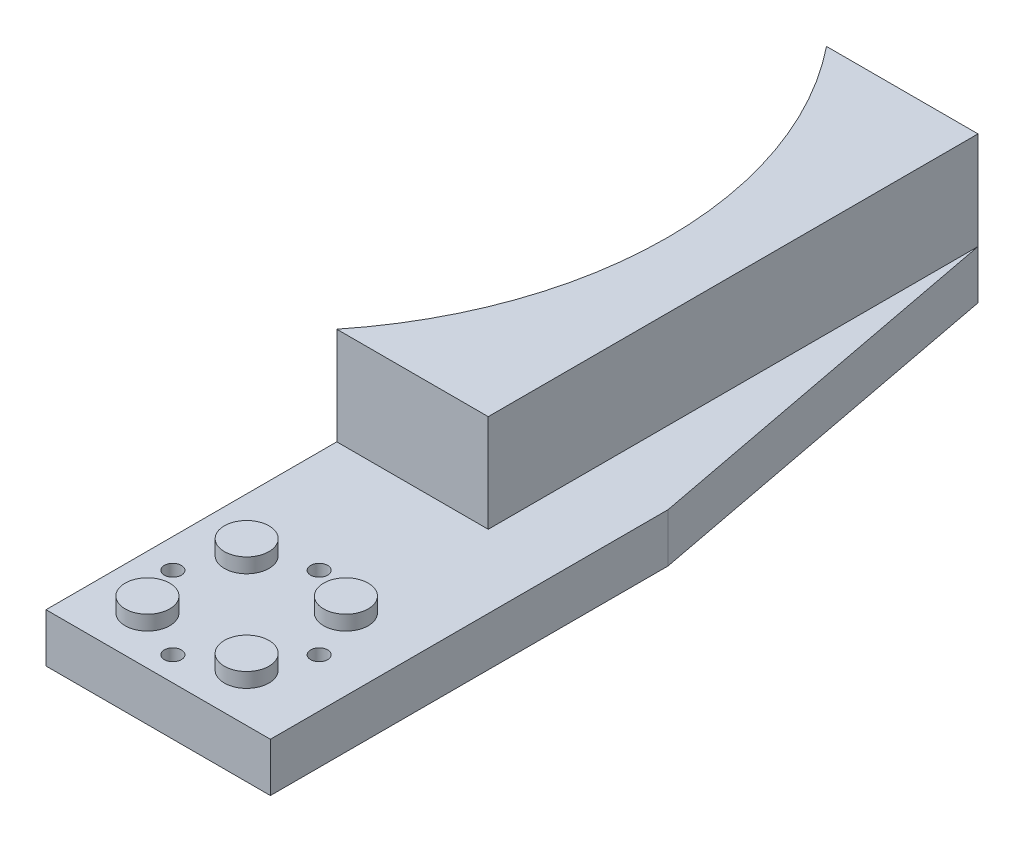
ISO-10303-21;
HEADER;
FILE_DESCRIPTION(('STEP AP214'),'2;1');
FILE_NAME('part.step','',(''),(''),'','','');
FILE_SCHEMA(('AUTOMOTIVE_DESIGN { 1 0 10303 214 1 1 1 1 }'));
ENDSEC;
DATA;
#1=APPLICATION_CONTEXT('core data for automotive mechanical design processes');
#2=APPLICATION_PROTOCOL_DEFINITION('international standard','automotive_design',2000,#1);
#3=PRODUCT_CONTEXT('',#1,'mechanical');
#4=PRODUCT('Part','Part','',(#3));
#5=PRODUCT_RELATED_PRODUCT_CATEGORY('part','',(#4));
#6=PRODUCT_DEFINITION_FORMATION('','',#4);
#7=PRODUCT_DEFINITION_CONTEXT('part definition',#1,'design');
#8=PRODUCT_DEFINITION('design','',#6,#7);
#9=PRODUCT_DEFINITION_SHAPE('','',#8);
#10=(LENGTH_UNIT() NAMED_UNIT(*) SI_UNIT(.MILLI.,.METRE.));
#11=(NAMED_UNIT(*) PLANE_ANGLE_UNIT() SI_UNIT($,.RADIAN.));
#12=(NAMED_UNIT(*) SI_UNIT($,.STERADIAN.) SOLID_ANGLE_UNIT());
#13=UNCERTAINTY_MEASURE_WITH_UNIT(LENGTH_MEASURE(1.E-05),#10,'distance_accuracy_value','');
#14=(GEOMETRIC_REPRESENTATION_CONTEXT(3) GLOBAL_UNCERTAINTY_ASSIGNED_CONTEXT((#13)) GLOBAL_UNIT_ASSIGNED_CONTEXT((#10,
#11,#12)) REPRESENTATION_CONTEXT('',''));
#15=CARTESIAN_POINT('',(0.,0.,0.));
#16=DIRECTION('',(0.,0.,1.));
#17=DIRECTION('',(1.,0.,0.));
#18=AXIS2_PLACEMENT_3D('',#15,#16,#17);
#19=CARTESIAN_POINT('',(0.,10.,0.));
#20=DIRECTION('',(0.,1.,0.));
#21=DIRECTION('',(0.,0.,1.));
#22=AXIS2_PLACEMENT_3D('',#19,#20,#21);
#23=PLANE('',#22);
#24=CARTESIAN_POINT('',(15.,10.,0.));
#25=DIRECTION('',(0.,1.,0.));
#26=DIRECTION('',(0.,0.,1.));
#27=AXIS2_PLACEMENT_3D('',#24,#25,#26);
#28=CIRCLE('',#27,1.75);
#29=CARTESIAN_POINT('',(15.,10.,1.75));
#30=VERTEX_POINT('',#29);
#31=EDGE_CURVE('E170',#30,#30,#28,.T.);
#32=ORIENTED_EDGE('',*,*,#31,.F.);
#33=EDGE_LOOP('',(#32));
#34=FACE_BOUND('',#33,.T.);
#35=CARTESIAN_POINT('',(-15.,10.,0.));
#36=DIRECTION('',(0.,1.,0.));
#37=DIRECTION('',(0.,0.,1.));
#38=AXIS2_PLACEMENT_3D('',#35,#36,#37);
#39=CIRCLE('',#38,1.75);
#40=CARTESIAN_POINT('',(-15.,10.,1.75));
#41=VERTEX_POINT('',#40);
#42=EDGE_CURVE('E173',#41,#41,#39,.T.);
#43=ORIENTED_EDGE('',*,*,#42,.F.);
#44=EDGE_LOOP('',(#43));
#45=FACE_BOUND('',#44,.T.);
#46=CARTESIAN_POINT('',(0.,10.,-15.));
#47=DIRECTION('',(0.,1.,0.));
#48=DIRECTION('',(0.,0.,1.));
#49=AXIS2_PLACEMENT_3D('',#46,#47,#48);
#50=CIRCLE('',#49,1.75);
#51=CARTESIAN_POINT('',(0.,10.,-13.25));
#52=VERTEX_POINT('',#51);
#53=EDGE_CURVE('E179',#52,#52,#50,.T.);
#54=ORIENTED_EDGE('',*,*,#53,.F.);
#55=EDGE_LOOP('',(#54));
#56=FACE_BOUND('',#55,.T.);
#57=CARTESIAN_POINT('',(0.,10.,15.));
#58=DIRECTION('',(0.,1.,0.));
#59=DIRECTION('',(0.,0.,1.));
#60=AXIS2_PLACEMENT_3D('',#57,#58,#59);
#61=CIRCLE('',#60,1.75);
#62=CARTESIAN_POINT('',(0.,10.,16.75));
#63=VERTEX_POINT('',#62);
#64=EDGE_CURVE('E185',#63,#63,#61,.T.);
#65=ORIENTED_EDGE('',*,*,#64,.F.);
#66=EDGE_LOOP('',(#65));
#67=FACE_BOUND('',#66,.T.);
#68=CARTESIAN_POINT('',(10.306950849907,10.,10.1718220925609));
#69=DIRECTION('',(0.,1.,0.));
#70=DIRECTION('',(0.707106781186544,0.,-0.707106781186551));
#71=AXIS2_PLACEMENT_3D('',#68,#69,#70);
#72=CIRCLE('',#71,4.575);
#73=CARTESIAN_POINT('',(13.5419643738354,10.,6.93680856863244));
#74=VERTEX_POINT('',#73);
#75=EDGE_CURVE('E209',#74,#74,#72,.T.);
#76=ORIENTED_EDGE('',*,*,#75,.F.);
#77=EDGE_LOOP('',(#76));
#78=FACE_BOUND('',#77,.T.);
#79=CARTESIAN_POINT('',(10.3069508499069,10.,-10.1718220925611));
#80=DIRECTION('',(0.,1.,0.));
#81=DIRECTION('',(-0.707106781186554,0.,-0.707106781186541));
#82=AXIS2_PLACEMENT_3D('',#79,#80,#81);
#83=CIRCLE('',#82,4.575);
#84=CARTESIAN_POINT('',(7.07193732597838,10.,-13.4068356164895));
#85=VERTEX_POINT('',#84);
#86=EDGE_CURVE('E202',#85,#85,#83,.T.);
#87=ORIENTED_EDGE('',*,*,#86,.F.);
#88=EDGE_LOOP('',(#87));
#89=FACE_BOUND('',#88,.T.);
#90=CARTESIAN_POINT('',(-10.0366933352151,10.,-10.1718220925608));
#91=DIRECTION('',(0.,1.,0.));
#92=DIRECTION('',(-0.707106781186539,0.,0.707106781186556));
#93=AXIS2_PLACEMENT_3D('',#90,#91,#92);
#94=CIRCLE('',#93,4.575);
#95=CARTESIAN_POINT('',(-13.2717068591435,10.,-6.93680856863235));
#96=VERTEX_POINT('',#95);
#97=EDGE_CURVE('E198',#96,#96,#94,.T.);
#98=ORIENTED_EDGE('',*,*,#97,.F.);
#99=EDGE_LOOP('',(#98));
#100=FACE_BOUND('',#99,.T.);
#101=CARTESIAN_POINT('',(-10.036693335215,10.,10.171822092561));
#102=DIRECTION('',(0.,1.,0.));
#103=DIRECTION('',(0.707106781186549,0.,0.707106781186546));
#104=AXIS2_PLACEMENT_3D('',#101,#102,#103);
#105=CIRCLE('',#104,4.575);
#106=CARTESIAN_POINT('',(-6.80167981128649,10.,13.4068356164894));
#107=VERTEX_POINT('',#106);
#108=EDGE_CURVE('E208',#107,#107,#105,.T.);
#109=ORIENTED_EDGE('',*,*,#108,.F.);
#110=EDGE_LOOP('',(#109));
#111=FACE_BOUND('',#110,.T.);
#112=DIRECTION('',(-0.187076296881143,0.,-0.982345386890598));
#113=VECTOR('',#112,1.);
#114=CARTESIAN_POINT('',(10.0516483873566,10.,-140.));
#115=LINE('',#114,#113);
#116=CARTESIAN_POINT('',(25.,10.,-61.5055862601955));
#117=VERTEX_POINT('',#116);
#118=CARTESIAN_POINT('',(10.0516483873566,10.,-140.));
#119=VERTEX_POINT('',#118);
#120=EDGE_CURVE('E153',#117,#119,#115,.T.);
#121=ORIENTED_EDGE('',*,*,#120,.T.);
#122=DIRECTION('',(0.,0.,-1.));
#123=VECTOR('',#122,1.);
#124=CARTESIAN_POINT('',(10.0516483873566,10.,-140.));
#125=LINE('',#124,#123);
#126=CARTESIAN_POINT('',(10.0516483873566,10.,-39.601862885216));
#127=VERTEX_POINT('',#126);
#128=EDGE_CURVE('E56',#127,#119,#125,.T.);
#129=ORIENTED_EDGE('',*,*,#128,.F.);
#130=DIRECTION('',(1.,0.,0.));
#131=VECTOR('',#130,1.);
#132=CARTESIAN_POINT('',(10.0516483873566,10.,-39.601862885216));
#133=LINE('',#132,#131);
#134=CARTESIAN_POINT('',(-21.,10.,-39.601862885216));
#135=VERTEX_POINT('',#134);
#136=EDGE_CURVE('E138',#135,#127,#133,.T.);
#137=ORIENTED_EDGE('',*,*,#136,.F.);
#138=DIRECTION('',(0.,0.,-1.));
#139=VECTOR('',#138,1.);
#140=CARTESIAN_POINT('',(-21.,10.,20.));
#141=LINE('',#140,#139);
#142=CARTESIAN_POINT('',(-21.,10.,20.));
#143=VERTEX_POINT('',#142);
#144=EDGE_CURVE('E159',#143,#135,#141,.T.);
#145=ORIENTED_EDGE('',*,*,#144,.F.);
#146=DIRECTION('',(-1.,0.,0.));
#147=VECTOR('',#146,1.);
#148=CARTESIAN_POINT('',(25.,10.,20.));
#149=LINE('',#148,#147);
#150=CARTESIAN_POINT('',(25.,10.,20.));
#151=VERTEX_POINT('',#150);
#152=EDGE_CURVE('E169',#151,#143,#149,.T.);
#153=ORIENTED_EDGE('',*,*,#152,.F.);
#154=DIRECTION('',(0.,0.,-1.));
#155=VECTOR('',#154,1.);
#156=CARTESIAN_POINT('',(25.,10.,-70.));
#157=LINE('',#156,#155);
#158=EDGE_CURVE('E11',#151,#117,#157,.T.);
#159=ORIENTED_EDGE('',*,*,#158,.T.);
#160=EDGE_LOOP('',(#121,#129,#137,#145,#153,#159));
#161=FACE_BOUND('',#160,.T.);
#162=ADVANCED_FACE('F41',(#34,#45,#56,#67,#78,#89,#100,#111,#161),#23,.T.);
#163=CARTESIAN_POINT('',(25.,10.,-70.));
#164=DIRECTION('',(-1.,0.,0.));
#165=DIRECTION('',(0.,0.,1.));
#166=AXIS2_PLACEMENT_3D('',#163,#164,#165);
#167=PLANE('',#166);
#168=DIRECTION('',(0.,0.,-1.));
#169=VECTOR('',#168,1.);
#170=CARTESIAN_POINT('',(25.,0.,-70.));
#171=LINE('',#170,#169);
#172=CARTESIAN_POINT('',(25.,0.,20.));
#173=VERTEX_POINT('',#172);
#174=CARTESIAN_POINT('',(25.,0.,-61.5055862601955));
#175=VERTEX_POINT('',#174);
#176=EDGE_CURVE('E45',#173,#175,#171,.T.);
#177=ORIENTED_EDGE('',*,*,#176,.T.);
#178=DIRECTION('',(0.,-1.,0.));
#179=VECTOR('',#178,1.);
#180=CARTESIAN_POINT('',(25.,10.,-61.5055862601955));
#181=LINE('',#180,#179);
#182=EDGE_CURVE('E155',#117,#175,#181,.T.);
#183=ORIENTED_EDGE('',*,*,#182,.F.);
#184=ORIENTED_EDGE('',*,*,#158,.F.);
#185=DIRECTION('',(0.,1.,0.));
#186=VECTOR('',#185,1.);
#187=CARTESIAN_POINT('',(25.,0.,20.));
#188=LINE('',#187,#186);
#189=EDGE_CURVE('E193',#173,#151,#188,.T.);
#190=ORIENTED_EDGE('',*,*,#189,.F.);
#191=EDGE_LOOP('',(#177,#183,#184,#190));
#192=FACE_BOUND('',#191,.T.);
#193=ADVANCED_FACE('F43',(#192),#167,.F.);
#194=CARTESIAN_POINT('',(0.,0.,0.));
#195=DIRECTION('',(0.,1.,0.));
#196=DIRECTION('',(0.,0.,1.));
#197=AXIS2_PLACEMENT_3D('',#194,#195,#196);
#198=PLANE('',#197);
#199=CARTESIAN_POINT('',(15.,0.,0.));
#200=DIRECTION('',(0.,1.,0.));
#201=DIRECTION('',(0.,0.,1.));
#202=AXIS2_PLACEMENT_3D('',#199,#200,#201);
#203=CIRCLE('',#202,1.75);
#204=CARTESIAN_POINT('',(15.,0.,1.75));
#205=VERTEX_POINT('',#204);
#206=EDGE_CURVE('E166',#205,#205,#203,.T.);
#207=ORIENTED_EDGE('',*,*,#206,.T.);
#208=EDGE_LOOP('',(#207));
#209=FACE_BOUND('',#208,.T.);
#210=CARTESIAN_POINT('',(-15.,0.,0.));
#211=DIRECTION('',(0.,1.,0.));
#212=DIRECTION('',(0.,0.,1.));
#213=AXIS2_PLACEMENT_3D('',#210,#211,#212);
#214=CIRCLE('',#213,1.75);
#215=CARTESIAN_POINT('',(-15.,0.,1.75));
#216=VERTEX_POINT('',#215);
#217=EDGE_CURVE('E176',#216,#216,#214,.T.);
#218=ORIENTED_EDGE('',*,*,#217,.T.);
#219=EDGE_LOOP('',(#218));
#220=FACE_BOUND('',#219,.T.);
#221=CARTESIAN_POINT('',(0.,0.,-15.));
#222=DIRECTION('',(0.,1.,0.));
#223=DIRECTION('',(0.,0.,1.));
#224=AXIS2_PLACEMENT_3D('',#221,#222,#223);
#225=CIRCLE('',#224,1.75);
#226=CARTESIAN_POINT('',(0.,0.,-13.25));
#227=VERTEX_POINT('',#226);
#228=EDGE_CURVE('E182',#227,#227,#225,.T.);
#229=ORIENTED_EDGE('',*,*,#228,.T.);
#230=EDGE_LOOP('',(#229));
#231=FACE_BOUND('',#230,.T.);
#232=CARTESIAN_POINT('',(0.,0.,15.));
#233=DIRECTION('',(0.,1.,0.));
#234=DIRECTION('',(0.,0.,1.));
#235=AXIS2_PLACEMENT_3D('',#232,#233,#234);
#236=CIRCLE('',#235,1.75);
#237=CARTESIAN_POINT('',(0.,0.,16.75));
#238=VERTEX_POINT('',#237);
#239=EDGE_CURVE('E118',#238,#238,#236,.T.);
#240=ORIENTED_EDGE('',*,*,#239,.T.);
#241=EDGE_LOOP('',(#240));
#242=FACE_BOUND('',#241,.T.);
#243=DIRECTION('',(0.,0.,-1.));
#244=VECTOR('',#243,1.);
#245=CARTESIAN_POINT('',(-21.,0.,20.));
#246=LINE('',#245,#244);
#247=CARTESIAN_POINT('',(-21.,0.,20.));
#248=VERTEX_POINT('',#247);
#249=CARTESIAN_POINT('',(-21.,0.,-39.601862885216));
#250=VERTEX_POINT('',#249);
#251=EDGE_CURVE('E161',#248,#250,#246,.T.);
#252=ORIENTED_EDGE('',*,*,#251,.T.);
#253=CARTESIAN_POINT('',(-83.6264533897523,0.,-89.800931442608));
#254=DIRECTION('',(0.,-1.,0.));
#255=DIRECTION('',(0.,0.,-1.));
#256=AXIS2_PLACEMENT_3D('',#253,#254,#255);
#257=CIRCLE('',#256,80.2621900287337);
#258=CARTESIAN_POINT('',(-21.,0.,-140.));
#259=VERTEX_POINT('',#258);
#260=EDGE_CURVE('E148',#259,#250,#257,.T.);
#261=ORIENTED_EDGE('',*,*,#260,.F.);
#262=DIRECTION('',(-1.,0.,0.));
#263=VECTOR('',#262,1.);
#264=CARTESIAN_POINT('',(25.,0.,-140.));
#265=LINE('',#264,#263);
#266=CARTESIAN_POINT('',(10.0516483873566,0.,-140.));
#267=VERTEX_POINT('',#266);
#268=EDGE_CURVE('E115',#267,#259,#265,.T.);
#269=ORIENTED_EDGE('',*,*,#268,.F.);
#270=DIRECTION('',(-0.187076296881143,0.,-0.982345386890598));
#271=VECTOR('',#270,1.);
#272=CARTESIAN_POINT('',(10.0516483873566,0.,-140.));
#273=LINE('',#272,#271);
#274=EDGE_CURVE('E64',#175,#267,#273,.T.);
#275=ORIENTED_EDGE('',*,*,#274,.F.);
#276=ORIENTED_EDGE('',*,*,#176,.F.);
#277=DIRECTION('',(-1.,0.,0.));
#278=VECTOR('',#277,1.);
#279=CARTESIAN_POINT('',(25.,0.,20.));
#280=LINE('',#279,#278);
#281=EDGE_CURVE('E190',#173,#248,#280,.T.);
#282=ORIENTED_EDGE('',*,*,#281,.T.);
#283=EDGE_LOOP('',(#252,#261,#269,#275,#276,#282));
#284=FACE_BOUND('',#283,.T.);
#285=ADVANCED_FACE('F246',(#209,#220,#231,#242,#284),#198,.F.);
#286=CARTESIAN_POINT('',(-10.036693335215,13.,10.171822092561));
#287=DIRECTION('',(0.,-1.,0.));
#288=DIRECTION('',(0.,0.,-1.));
#289=AXIS2_PLACEMENT_3D('',#286,#287,#288);
#290=CYLINDRICAL_SURFACE('',#289,4.575);
#291=CARTESIAN_POINT('',(-10.036693335215,13.,10.171822092561));
#292=DIRECTION('',(0.,1.,0.));
#293=DIRECTION('',(0.707106781186549,0.,0.707106781186546));
#294=AXIS2_PLACEMENT_3D('',#291,#292,#293);
#295=CIRCLE('',#294,4.575);
#296=CARTESIAN_POINT('',(-6.80167981128649,13.,13.4068356164894));
#297=VERTEX_POINT('',#296);
#298=EDGE_CURVE('E217',#297,#297,#295,.T.);
#299=ORIENTED_EDGE('',*,*,#298,.F.);
#300=EDGE_LOOP('',(#299));
#301=FACE_BOUND('',#300,.T.);
#302=ORIENTED_EDGE('',*,*,#108,.T.);
#303=EDGE_LOOP('',(#302));
#304=FACE_BOUND('',#303,.T.);
#305=ADVANCED_FACE('F223',(#301,#304),#290,.T.);
#306=CARTESIAN_POINT('',(-10.036693335215,13.,10.171822092561));
#307=DIRECTION('',(0.,1.,0.));
#308=DIRECTION('',(0.707106781186549,0.,0.707106781186546));
#309=AXIS2_PLACEMENT_3D('',#306,#307,#308);
#310=PLANE('',#309);
#311=ORIENTED_EDGE('',*,*,#298,.T.);
#312=EDGE_LOOP('',(#311));
#313=FACE_BOUND('',#312,.T.);
#314=ADVANCED_FACE('F287',(#313),#310,.T.);
#315=CARTESIAN_POINT('',(-10.0366933352151,13.,-10.1718220925608));
#316=DIRECTION('',(0.,-1.,0.));
#317=DIRECTION('',(0.,0.,-1.));
#318=AXIS2_PLACEMENT_3D('',#315,#316,#317);
#319=CYLINDRICAL_SURFACE('',#318,4.575);
#320=CARTESIAN_POINT('',(-10.0366933352151,13.,-10.1718220925608));
#321=DIRECTION('',(0.,1.,0.));
#322=DIRECTION('',(-0.707106781186539,0.,0.707106781186556));
#323=AXIS2_PLACEMENT_3D('',#320,#321,#322);
#324=CIRCLE('',#323,4.575);
#325=CARTESIAN_POINT('',(-13.2717068591435,13.,-6.93680856863235));
#326=VERTEX_POINT('',#325);
#327=EDGE_CURVE('E199',#326,#326,#324,.T.);
#328=ORIENTED_EDGE('',*,*,#327,.F.);
#329=EDGE_LOOP('',(#328));
#330=FACE_BOUND('',#329,.T.);
#331=ORIENTED_EDGE('',*,*,#97,.T.);
#332=EDGE_LOOP('',(#331));
#333=FACE_BOUND('',#332,.T.);
#334=ADVANCED_FACE('F283',(#330,#333),#319,.T.);
#335=CARTESIAN_POINT('',(-10.0366933352151,13.,-10.1718220925608));
#336=DIRECTION('',(0.,1.,0.));
#337=DIRECTION('',(-0.707106781186539,0.,0.707106781186556));
#338=AXIS2_PLACEMENT_3D('',#335,#336,#337);
#339=PLANE('',#338);
#340=ORIENTED_EDGE('',*,*,#327,.T.);
#341=EDGE_LOOP('',(#340));
#342=FACE_BOUND('',#341,.T.);
#343=ADVANCED_FACE('F279',(#342),#339,.T.);
#344=CARTESIAN_POINT('',(10.3069508499069,13.,-10.1718220925611));
#345=DIRECTION('',(0.,-1.,0.));
#346=DIRECTION('',(0.,0.,-1.));
#347=AXIS2_PLACEMENT_3D('',#344,#345,#346);
#348=CYLINDRICAL_SURFACE('',#347,4.575);
#349=CARTESIAN_POINT('',(10.3069508499069,13.,-10.1718220925611));
#350=DIRECTION('',(0.,1.,0.));
#351=DIRECTION('',(-0.707106781186554,0.,-0.707106781186541));
#352=AXIS2_PLACEMENT_3D('',#349,#350,#351);
#353=CIRCLE('',#352,4.575);
#354=CARTESIAN_POINT('',(7.07193732597838,13.,-13.4068356164895));
#355=VERTEX_POINT('',#354);
#356=EDGE_CURVE('E212',#355,#355,#353,.T.);
#357=ORIENTED_EDGE('',*,*,#356,.F.);
#358=EDGE_LOOP('',(#357));
#359=FACE_BOUND('',#358,.T.);
#360=ORIENTED_EDGE('',*,*,#86,.T.);
#361=EDGE_LOOP('',(#360));
#362=FACE_BOUND('',#361,.T.);
#363=ADVANCED_FACE('F282',(#359,#362),#348,.T.);
#364=CARTESIAN_POINT('',(10.3069508499069,13.,-10.1718220925611));
#365=DIRECTION('',(0.,1.,0.));
#366=DIRECTION('',(-0.707106781186554,0.,-0.707106781186541));
#367=AXIS2_PLACEMENT_3D('',#364,#365,#366);
#368=PLANE('',#367);
#369=ORIENTED_EDGE('',*,*,#356,.T.);
#370=EDGE_LOOP('',(#369));
#371=FACE_BOUND('',#370,.T.);
#372=ADVANCED_FACE('F295',(#371),#368,.T.);
#373=CARTESIAN_POINT('',(10.306950849907,13.,10.1718220925609));
#374=DIRECTION('',(0.,-1.,0.));
#375=DIRECTION('',(0.,0.,-1.));
#376=AXIS2_PLACEMENT_3D('',#373,#374,#375);
#377=CYLINDRICAL_SURFACE('',#376,4.575);
#378=CARTESIAN_POINT('',(10.306950849907,13.,10.1718220925609));
#379=DIRECTION('',(0.,1.,0.));
#380=DIRECTION('',(0.707106781186544,0.,-0.707106781186551));
#381=AXIS2_PLACEMENT_3D('',#378,#379,#380);
#382=CIRCLE('',#381,4.575);
#383=CARTESIAN_POINT('',(13.5419643738354,13.,6.93680856863244));
#384=VERTEX_POINT('',#383);
#385=EDGE_CURVE('E205',#384,#384,#382,.T.);
#386=ORIENTED_EDGE('',*,*,#385,.F.);
#387=EDGE_LOOP('',(#386));
#388=FACE_BOUND('',#387,.T.);
#389=ORIENTED_EDGE('',*,*,#75,.T.);
#390=EDGE_LOOP('',(#389));
#391=FACE_BOUND('',#390,.T.);
#392=ADVANCED_FACE('F291',(#388,#391),#377,.T.);
#393=CARTESIAN_POINT('',(10.306950849907,13.,10.1718220925609));
#394=DIRECTION('',(0.,1.,0.));
#395=DIRECTION('',(0.707106781186544,0.,-0.707106781186551));
#396=AXIS2_PLACEMENT_3D('',#393,#394,#395);
#397=PLANE('',#396);
#398=ORIENTED_EDGE('',*,*,#385,.T.);
#399=EDGE_LOOP('',(#398));
#400=FACE_BOUND('',#399,.T.);
#401=ADVANCED_FACE('F278',(#400),#397,.T.);
#402=CARTESIAN_POINT('',(0.,0.,-140.));
#403=DIRECTION('',(0.,0.,-1.));
#404=DIRECTION('',(-1.,0.,0.));
#405=AXIS2_PLACEMENT_3D('',#402,#403,#404);
#406=PLANE('',#405);
#407=DIRECTION('',(0.,-1.,0.));
#408=VECTOR('',#407,1.);
#409=CARTESIAN_POINT('',(10.0516483873566,10.,-140.));
#410=LINE('',#409,#408);
#411=EDGE_CURVE('E157',#119,#267,#410,.T.);
#412=ORIENTED_EDGE('',*,*,#411,.T.);
#413=ORIENTED_EDGE('',*,*,#268,.T.);
#414=DIRECTION('',(0.,1.,0.));
#415=VECTOR('',#414,1.);
#416=CARTESIAN_POINT('',(-21.,0.,-140.));
#417=LINE('',#416,#415);
#418=CARTESIAN_POINT('',(-21.,30.,-140.));
#419=VERTEX_POINT('',#418);
#420=EDGE_CURVE('E107',#259,#419,#417,.T.);
#421=ORIENTED_EDGE('',*,*,#420,.T.);
#422=DIRECTION('',(-1.,0.,0.));
#423=VECTOR('',#422,1.);
#424=CARTESIAN_POINT('',(10.0516483873566,30.,-140.));
#425=LINE('',#424,#423);
#426=CARTESIAN_POINT('',(10.0516483873566,30.,-140.));
#427=VERTEX_POINT('',#426);
#428=EDGE_CURVE('E112',#427,#419,#425,.T.);
#429=ORIENTED_EDGE('',*,*,#428,.F.);
#430=DIRECTION('',(0.,-1.,0.));
#431=VECTOR('',#430,1.);
#432=CARTESIAN_POINT('',(10.0516483873566,30.,-140.));
#433=LINE('',#432,#431);
#434=EDGE_CURVE('E146',#427,#119,#433,.T.);
#435=ORIENTED_EDGE('',*,*,#434,.T.);
#436=EDGE_LOOP('',(#412,#413,#421,#429,#435));
#437=FACE_BOUND('',#436,.T.);
#438=ADVANCED_FACE('F109',(#437),#406,.T.);
#439=CARTESIAN_POINT('',(25.,0.,20.));
#440=DIRECTION('',(0.,0.,-1.));
#441=DIRECTION('',(-1.,0.,0.));
#442=AXIS2_PLACEMENT_3D('',#439,#440,#441);
#443=PLANE('',#442);
#444=ORIENTED_EDGE('',*,*,#152,.T.);
#445=DIRECTION('',(0.,1.,0.));
#446=VECTOR('',#445,1.);
#447=CARTESIAN_POINT('',(-21.,0.,20.));
#448=LINE('',#447,#446);
#449=EDGE_CURVE('E119',#248,#143,#448,.T.);
#450=ORIENTED_EDGE('',*,*,#449,.F.);
#451=ORIENTED_EDGE('',*,*,#281,.F.);
#452=ORIENTED_EDGE('',*,*,#189,.T.);
#453=EDGE_LOOP('',(#444,#450,#451,#452));
#454=FACE_BOUND('',#453,.T.);
#455=ADVANCED_FACE('F240',(#454),#443,.F.);
#456=CARTESIAN_POINT('',(0.,0.,15.));
#457=DIRECTION('',(0.,1.,0.));
#458=DIRECTION('',(0.,0.,1.));
#459=AXIS2_PLACEMENT_3D('',#456,#457,#458);
#460=CYLINDRICAL_SURFACE('',#459,1.75);
#461=ORIENTED_EDGE('',*,*,#239,.F.);
#462=EDGE_LOOP('',(#461));
#463=FACE_BOUND('',#462,.T.);
#464=ORIENTED_EDGE('',*,*,#64,.T.);
#465=EDGE_LOOP('',(#464));
#466=FACE_BOUND('',#465,.T.);
#467=ADVANCED_FACE('F270',(#463,#466),#460,.F.);
#468=CARTESIAN_POINT('',(0.,0.,-15.));
#469=DIRECTION('',(0.,1.,0.));
#470=DIRECTION('',(0.,0.,1.));
#471=AXIS2_PLACEMENT_3D('',#468,#469,#470);
#472=CYLINDRICAL_SURFACE('',#471,1.75);
#473=ORIENTED_EDGE('',*,*,#228,.F.);
#474=EDGE_LOOP('',(#473));
#475=FACE_BOUND('',#474,.T.);
#476=ORIENTED_EDGE('',*,*,#53,.T.);
#477=EDGE_LOOP('',(#476));
#478=FACE_BOUND('',#477,.T.);
#479=ADVANCED_FACE('F266',(#475,#478),#472,.F.);
#480=CARTESIAN_POINT('',(-15.,0.,0.));
#481=DIRECTION('',(0.,1.,0.));
#482=DIRECTION('',(0.,0.,1.));
#483=AXIS2_PLACEMENT_3D('',#480,#481,#482);
#484=CYLINDRICAL_SURFACE('',#483,1.75);
#485=ORIENTED_EDGE('',*,*,#217,.F.);
#486=EDGE_LOOP('',(#485));
#487=FACE_BOUND('',#486,.T.);
#488=ORIENTED_EDGE('',*,*,#42,.T.);
#489=EDGE_LOOP('',(#488));
#490=FACE_BOUND('',#489,.T.);
#491=ADVANCED_FACE('F259',(#487,#490),#484,.F.);
#492=CARTESIAN_POINT('',(15.,0.,0.));
#493=DIRECTION('',(0.,1.,0.));
#494=DIRECTION('',(0.,0.,1.));
#495=AXIS2_PLACEMENT_3D('',#492,#493,#494);
#496=CYLINDRICAL_SURFACE('',#495,1.75);
#497=ORIENTED_EDGE('',*,*,#206,.F.);
#498=EDGE_LOOP('',(#497));
#499=FACE_BOUND('',#498,.T.);
#500=ORIENTED_EDGE('',*,*,#31,.T.);
#501=EDGE_LOOP('',(#500));
#502=FACE_BOUND('',#501,.T.);
#503=ADVANCED_FACE('F250',(#499,#502),#496,.F.);
#504=CARTESIAN_POINT('',(-21.,0.,20.));
#505=DIRECTION('',(1.,0.,0.));
#506=DIRECTION('',(0.,0.,-1.));
#507=AXIS2_PLACEMENT_3D('',#504,#505,#506);
#508=PLANE('',#507);
#509=ORIENTED_EDGE('',*,*,#144,.T.);
#510=DIRECTION('',(0.,-1.,0.));
#511=VECTOR('',#510,1.);
#512=CARTESIAN_POINT('',(-21.,10.,-39.601862885216));
#513=LINE('',#512,#511);
#514=EDGE_CURVE('E150',#135,#250,#513,.T.);
#515=ORIENTED_EDGE('',*,*,#514,.T.);
#516=ORIENTED_EDGE('',*,*,#251,.F.);
#517=ORIENTED_EDGE('',*,*,#449,.T.);
#518=EDGE_LOOP('',(#509,#515,#516,#517));
#519=FACE_BOUND('',#518,.T.);
#520=ADVANCED_FACE('F247',(#519),#508,.F.);
#521=CARTESIAN_POINT('',(10.0516483873566,10.,-140.));
#522=DIRECTION('',(-0.982345386890598,0.,0.187076296881143));
#523=DIRECTION('',(0.187076296881143,0.,0.982345386890598));
#524=AXIS2_PLACEMENT_3D('',#521,#522,#523);
#525=PLANE('',#524);
#526=ORIENTED_EDGE('',*,*,#274,.T.);
#527=ORIENTED_EDGE('',*,*,#411,.F.);
#528=ORIENTED_EDGE('',*,*,#120,.F.);
#529=ORIENTED_EDGE('',*,*,#182,.T.);
#530=EDGE_LOOP('',(#526,#527,#528,#529));
#531=FACE_BOUND('',#530,.T.);
#532=ADVANCED_FACE('F249',(#531),#525,.F.);
#533=CARTESIAN_POINT('',(-83.6264533897523,10.,-89.800931442608));
#534=DIRECTION('',(0.,-1.,0.));
#535=DIRECTION('',(0.,0.,-1.));
#536=AXIS2_PLACEMENT_3D('',#533,#534,#535);
#537=CYLINDRICAL_SURFACE('',#536,80.2621900287337);
#538=ORIENTED_EDGE('',*,*,#260,.T.);
#539=ORIENTED_EDGE('',*,*,#514,.F.);
#540=DIRECTION('',(0.,-1.,0.));
#541=VECTOR('',#540,1.);
#542=CARTESIAN_POINT('',(-21.,30.,-39.601862885216));
#543=LINE('',#542,#541);
#544=CARTESIAN_POINT('',(-21.,30.,-39.601862885216));
#545=VERTEX_POINT('',#544);
#546=EDGE_CURVE('E126',#545,#135,#543,.T.);
#547=ORIENTED_EDGE('',*,*,#546,.F.);
#548=CARTESIAN_POINT('',(-83.6264533897678,30.,-89.800931442608));
#549=DIRECTION('',(0.,-1.,0.));
#550=DIRECTION('',(0.,0.,-1.));
#551=AXIS2_PLACEMENT_3D('',#548,#549,#550);
#552=CIRCLE('',#551,80.2621900287458);
#553=EDGE_CURVE('E122',#419,#545,#552,.T.);
#554=ORIENTED_EDGE('',*,*,#553,.F.);
#555=ORIENTED_EDGE('',*,*,#420,.F.);
#556=EDGE_LOOP('',(#538,#539,#547,#554,#555));
#557=FACE_BOUND('',#556,.T.);
#558=ADVANCED_FACE('F123',(#557),#537,.F.);
#559=CARTESIAN_POINT('',(10.0516483873566,30.,-140.));
#560=DIRECTION('',(-1.,0.,0.));
#561=DIRECTION('',(0.,0.,1.));
#562=AXIS2_PLACEMENT_3D('',#559,#560,#561);
#563=PLANE('',#562);
#564=ORIENTED_EDGE('',*,*,#128,.T.);
#565=ORIENTED_EDGE('',*,*,#434,.F.);
#566=DIRECTION('',(0.,0.,-1.));
#567=VECTOR('',#566,1.);
#568=CARTESIAN_POINT('',(10.0516483873566,30.,-140.));
#569=LINE('',#568,#567);
#570=CARTESIAN_POINT('',(10.0516483873566,30.,-39.601862885216));
#571=VERTEX_POINT('',#570);
#572=EDGE_CURVE('E132',#571,#427,#569,.T.);
#573=ORIENTED_EDGE('',*,*,#572,.F.);
#574=DIRECTION('',(0.,-1.,0.));
#575=VECTOR('',#574,1.);
#576=CARTESIAN_POINT('',(10.0516483873566,30.,-39.601862885216));
#577=LINE('',#576,#575);
#578=EDGE_CURVE('E136',#571,#127,#577,.T.);
#579=ORIENTED_EDGE('',*,*,#578,.T.);
#580=EDGE_LOOP('',(#564,#565,#573,#579));
#581=FACE_BOUND('',#580,.T.);
#582=ADVANCED_FACE('F232',(#581),#563,.F.);
#583=CARTESIAN_POINT('',(10.0516483873566,30.,-39.601862885216));
#584=DIRECTION('',(0.,0.,-1.));
#585=DIRECTION('',(-1.,0.,0.));
#586=AXIS2_PLACEMENT_3D('',#583,#584,#585);
#587=PLANE('',#586);
#588=ORIENTED_EDGE('',*,*,#136,.T.);
#589=ORIENTED_EDGE('',*,*,#578,.F.);
#590=DIRECTION('',(1.,0.,0.));
#591=VECTOR('',#590,1.);
#592=CARTESIAN_POINT('',(10.0516483873566,30.,-39.601862885216));
#593=LINE('',#592,#591);
#594=EDGE_CURVE('E134',#545,#571,#593,.T.);
#595=ORIENTED_EDGE('',*,*,#594,.F.);
#596=ORIENTED_EDGE('',*,*,#546,.T.);
#597=EDGE_LOOP('',(#588,#589,#595,#596));
#598=FACE_BOUND('',#597,.T.);
#599=ADVANCED_FACE('F235',(#598),#587,.F.);
#600=CARTESIAN_POINT('',(0.,30.,0.));
#601=DIRECTION('',(0.,-1.,0.));
#602=DIRECTION('',(0.,0.,-1.));
#603=AXIS2_PLACEMENT_3D('',#600,#601,#602);
#604=PLANE('',#603);
#605=ORIENTED_EDGE('',*,*,#428,.T.);
#606=ORIENTED_EDGE('',*,*,#553,.T.);
#607=ORIENTED_EDGE('',*,*,#594,.T.);
#608=ORIENTED_EDGE('',*,*,#572,.T.);
#609=EDGE_LOOP('',(#605,#606,#607,#608));
#610=FACE_BOUND('',#609,.T.);
#611=ADVANCED_FACE('F130',(#610),#604,.F.);
#612=CLOSED_SHELL('',(#162,#193,#285,#305,#314,#334,#343,#363,#372,#392,#401,#438,#455,#467,
#479,#491,#503,#520,#532,#558,#582,#599,#611));
#613=MANIFOLD_SOLID_BREP('B2',#612);
#614=ADVANCED_BREP_SHAPE_REPRESENTATION('',(#18,#613),#14);
#615=SHAPE_DEFINITION_REPRESENTATION(#9,#614);
ENDSEC;
END-ISO-10303-21;
